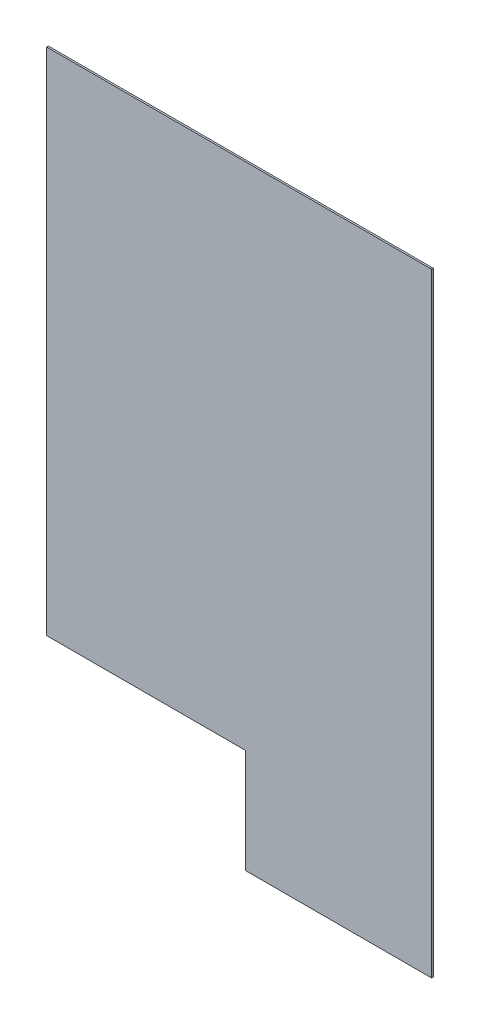
ISO-10303-21;
HEADER;
FILE_DESCRIPTION(('STEP AP214'),'2;1');
FILE_NAME('part.step','',(''),(''),'','','');
FILE_SCHEMA(('AUTOMOTIVE_DESIGN { 1 0 10303 214 1 1 1 1 }'));
ENDSEC;
DATA;
#1=APPLICATION_CONTEXT('core data for automotive mechanical design processes');
#2=APPLICATION_PROTOCOL_DEFINITION('international standard','automotive_design',2000,#1);
#3=PRODUCT_CONTEXT('',#1,'mechanical');
#4=PRODUCT('Part','Part','',(#3));
#5=PRODUCT_RELATED_PRODUCT_CATEGORY('part','',(#4));
#6=PRODUCT_DEFINITION_FORMATION('','',#4);
#7=PRODUCT_DEFINITION_CONTEXT('part definition',#1,'design');
#8=PRODUCT_DEFINITION('design','',#6,#7);
#9=PRODUCT_DEFINITION_SHAPE('','',#8);
#10=(LENGTH_UNIT() NAMED_UNIT(*) SI_UNIT(.MILLI.,.METRE.));
#11=(NAMED_UNIT(*) PLANE_ANGLE_UNIT() SI_UNIT($,.RADIAN.));
#12=(NAMED_UNIT(*) SI_UNIT($,.STERADIAN.) SOLID_ANGLE_UNIT());
#13=UNCERTAINTY_MEASURE_WITH_UNIT(LENGTH_MEASURE(1.E-05),#10,'distance_accuracy_value','');
#14=(GEOMETRIC_REPRESENTATION_CONTEXT(3) GLOBAL_UNCERTAINTY_ASSIGNED_CONTEXT((#13)) GLOBAL_UNIT_ASSIGNED_CONTEXT((#10,
#11,#12)) REPRESENTATION_CONTEXT('',''));
#15=CARTESIAN_POINT('',(0.,0.,0.));
#16=DIRECTION('',(0.,0.,1.));
#17=DIRECTION('',(1.,0.,0.));
#18=AXIS2_PLACEMENT_3D('',#15,#16,#17);
#19=CARTESIAN_POINT('',(47.729000091553,-0.123999997973,0.41148));
#20=DIRECTION('',(0.,0.,-1.));
#21=DIRECTION('',(0.,-1.,0.));
#22=AXIS2_PLACEMENT_3D('',#19,#20,#21);
#23=PLANE('',#22);
#24=DIRECTION('',(-1.,0.,0.));
#25=VECTOR('',#24,1.);
#26=CARTESIAN_POINT('',(92.5,-0.123999997973,0.41148));
#27=LINE('',#26,#25);
#28=CARTESIAN_POINT('',(92.5,-0.123999997973,0.41148));
#29=VERTEX_POINT('',#28);
#30=CARTESIAN_POINT('',(47.729000091553,-0.123999997973,0.41148));
#31=VERTEX_POINT('',#30);
#32=EDGE_CURVE('E27',#29,#31,#27,.T.);
#33=ORIENTED_EDGE('',*,*,#32,.F.);
#34=DIRECTION('',(0.,-1.,0.));
#35=VECTOR('',#34,1.);
#36=CARTESIAN_POINT('',(92.5,147.37600708007,0.41148));
#37=LINE('',#36,#35);
#38=CARTESIAN_POINT('',(92.5,147.37600708007,0.41148));
#39=VERTEX_POINT('',#38);
#40=EDGE_CURVE('E128',#39,#29,#37,.T.);
#41=ORIENTED_EDGE('',*,*,#40,.F.);
#42=DIRECTION('',(1.,0.,0.));
#43=VECTOR('',#42,1.);
#44=CARTESIAN_POINT('',(0.,147.37600708007,0.41148));
#45=LINE('',#44,#43);
#46=CARTESIAN_POINT('',(0.,147.37600708007,0.41148));
#47=VERTEX_POINT('',#46);
#48=EDGE_CURVE('E97',#47,#39,#45,.T.);
#49=ORIENTED_EDGE('',*,*,#48,.F.);
#50=DIRECTION('',(0.,1.,0.));
#51=VECTOR('',#50,1.);
#52=CARTESIAN_POINT('',(0.,24.875999450684,0.41148));
#53=LINE('',#52,#51);
#54=CARTESIAN_POINT('',(0.,24.875999450684,0.41148));
#55=VERTEX_POINT('',#54);
#56=EDGE_CURVE('E20',#55,#47,#53,.T.);
#57=ORIENTED_EDGE('',*,*,#56,.F.);
#58=DIRECTION('',(-1.,0.,0.));
#59=VECTOR('',#58,1.);
#60=CARTESIAN_POINT('',(47.729000091553,24.875999450684,0.41148));
#61=LINE('',#60,#59);
#62=CARTESIAN_POINT('',(47.729000091553,24.875999450684,0.41148));
#63=VERTEX_POINT('',#62);
#64=EDGE_CURVE('E95',#63,#55,#61,.T.);
#65=ORIENTED_EDGE('',*,*,#64,.F.);
#66=DIRECTION('',(0.,1.,0.));
#67=VECTOR('',#66,1.);
#68=CARTESIAN_POINT('',(47.729000091553,-0.123999997973,0.41148));
#69=LINE('',#68,#67);
#70=EDGE_CURVE('E124',#31,#63,#69,.T.);
#71=ORIENTED_EDGE('',*,*,#70,.F.);
#72=EDGE_LOOP('',(#33,#41,#49,#57,#65,#71));
#73=FACE_BOUND('',#72,.T.);
#74=ADVANCED_FACE('F16',(#73),#23,.F.);
#75=CARTESIAN_POINT('',(47.729000091553,-0.123999997973,0.));
#76=DIRECTION('',(0.,0.,-1.));
#77=DIRECTION('',(0.,-1.,0.));
#78=AXIS2_PLACEMENT_3D('',#75,#76,#77);
#79=PLANE('',#78);
#80=DIRECTION('',(0.,1.,0.));
#81=VECTOR('',#80,1.);
#82=CARTESIAN_POINT('',(47.729000091553,-0.123999997973,0.));
#83=LINE('',#82,#81);
#84=CARTESIAN_POINT('',(47.729000091553,-0.123999997973,0.));
#85=VERTEX_POINT('',#84);
#86=CARTESIAN_POINT('',(47.729000091553,24.875999450684,0.));
#87=VERTEX_POINT('',#86);
#88=EDGE_CURVE('E114',#85,#87,#83,.T.);
#89=ORIENTED_EDGE('',*,*,#88,.T.);
#90=DIRECTION('',(-1.,0.,0.));
#91=VECTOR('',#90,1.);
#92=CARTESIAN_POINT('',(47.729000091553,24.875999450684,0.));
#93=LINE('',#92,#91);
#94=CARTESIAN_POINT('',(0.,24.875999450684,0.));
#95=VERTEX_POINT('',#94);
#96=EDGE_CURVE('E85',#87,#95,#93,.T.);
#97=ORIENTED_EDGE('',*,*,#96,.T.);
#98=DIRECTION('',(0.,1.,0.));
#99=VECTOR('',#98,1.);
#100=CARTESIAN_POINT('',(0.,24.875999450684,0.));
#101=LINE('',#100,#99);
#102=CARTESIAN_POINT('',(0.,147.37600708007,0.));
#103=VERTEX_POINT('',#102);
#104=EDGE_CURVE('E106',#95,#103,#101,.T.);
#105=ORIENTED_EDGE('',*,*,#104,.T.);
#106=DIRECTION('',(1.,0.,0.));
#107=VECTOR('',#106,1.);
#108=CARTESIAN_POINT('',(0.,147.37600708007,0.));
#109=LINE('',#108,#107);
#110=CARTESIAN_POINT('',(92.5,147.37600708007,0.));
#111=VERTEX_POINT('',#110);
#112=EDGE_CURVE('E132',#103,#111,#109,.T.);
#113=ORIENTED_EDGE('',*,*,#112,.T.);
#114=DIRECTION('',(0.,-1.,0.));
#115=VECTOR('',#114,1.);
#116=CARTESIAN_POINT('',(92.5,147.37600708007,0.));
#117=LINE('',#116,#115);
#118=CARTESIAN_POINT('',(92.5,-0.123999997973,0.));
#119=VERTEX_POINT('',#118);
#120=EDGE_CURVE('E144',#111,#119,#117,.T.);
#121=ORIENTED_EDGE('',*,*,#120,.T.);
#122=DIRECTION('',(-1.,0.,0.));
#123=VECTOR('',#122,1.);
#124=CARTESIAN_POINT('',(92.5,-0.123999997973,0.));
#125=LINE('',#124,#123);
#126=EDGE_CURVE('E11',#119,#85,#125,.T.);
#127=ORIENTED_EDGE('',*,*,#126,.T.);
#128=EDGE_LOOP('',(#89,#97,#105,#113,#121,#127));
#129=FACE_BOUND('',#128,.T.);
#130=ADVANCED_FACE('F18',(#129),#79,.T.);
#131=CARTESIAN_POINT('',(92.5,-0.123999997973,0.));
#132=DIRECTION('',(0.,-1.,0.));
#133=DIRECTION('',(0.,0.,-1.));
#134=AXIS2_PLACEMENT_3D('',#131,#132,#133);
#135=PLANE('',#134);
#136=DIRECTION('',(0.,0.,1.));
#137=VECTOR('',#136,1.);
#138=CARTESIAN_POINT('',(92.5,-0.123999997973,0.));
#139=LINE('',#138,#137);
#140=EDGE_CURVE('E131',#119,#29,#139,.T.);
#141=ORIENTED_EDGE('',*,*,#140,.T.);
#142=ORIENTED_EDGE('',*,*,#32,.T.);
#143=DIRECTION('',(0.,0.,1.));
#144=VECTOR('',#143,1.);
#145=CARTESIAN_POINT('',(47.729000091553,-0.123999997973,0.));
#146=LINE('',#145,#144);
#147=EDGE_CURVE('E126',#85,#31,#146,.T.);
#148=ORIENTED_EDGE('',*,*,#147,.F.);
#149=ORIENTED_EDGE('',*,*,#126,.F.);
#150=EDGE_LOOP('',(#141,#142,#148,#149));
#151=FACE_BOUND('',#150,.T.);
#152=ADVANCED_FACE('F160',(#151),#135,.T.);
#153=CARTESIAN_POINT('',(92.5,147.37600708007,0.));
#154=DIRECTION('',(1.,0.,0.));
#155=DIRECTION('',(0.,1.,0.));
#156=AXIS2_PLACEMENT_3D('',#153,#154,#155);
#157=PLANE('',#156);
#158=DIRECTION('',(0.,0.,1.));
#159=VECTOR('',#158,1.);
#160=CARTESIAN_POINT('',(92.5,147.37600708007,0.));
#161=LINE('',#160,#159);
#162=EDGE_CURVE('E136',#111,#39,#161,.T.);
#163=ORIENTED_EDGE('',*,*,#162,.T.);
#164=ORIENTED_EDGE('',*,*,#40,.T.);
#165=ORIENTED_EDGE('',*,*,#140,.F.);
#166=ORIENTED_EDGE('',*,*,#120,.F.);
#167=EDGE_LOOP('',(#163,#164,#165,#166));
#168=FACE_BOUND('',#167,.T.);
#169=ADVANCED_FACE('F162',(#168),#157,.T.);
#170=CARTESIAN_POINT('',(0.,147.37600708007,0.));
#171=DIRECTION('',(0.,1.,0.));
#172=DIRECTION('',(1.,0.,0.));
#173=AXIS2_PLACEMENT_3D('',#170,#171,#172);
#174=PLANE('',#173);
#175=DIRECTION('',(0.,0.,1.));
#176=VECTOR('',#175,1.);
#177=CARTESIAN_POINT('',(0.,147.37600708007,0.));
#178=LINE('',#177,#176);
#179=EDGE_CURVE('E102',#103,#47,#178,.T.);
#180=ORIENTED_EDGE('',*,*,#179,.T.);
#181=ORIENTED_EDGE('',*,*,#48,.T.);
#182=ORIENTED_EDGE('',*,*,#162,.F.);
#183=ORIENTED_EDGE('',*,*,#112,.F.);
#184=EDGE_LOOP('',(#180,#181,#182,#183));
#185=FACE_BOUND('',#184,.T.);
#186=ADVANCED_FACE('F167',(#185),#174,.T.);
#187=CARTESIAN_POINT('',(0.,24.875999450684,0.));
#188=DIRECTION('',(-1.,0.,0.));
#189=DIRECTION('',(0.,0.,1.));
#190=AXIS2_PLACEMENT_3D('',#187,#188,#189);
#191=PLANE('',#190);
#192=DIRECTION('',(0.,0.,1.));
#193=VECTOR('',#192,1.);
#194=CARTESIAN_POINT('',(0.,24.875999450684,0.));
#195=LINE('',#194,#193);
#196=EDGE_CURVE('E103',#95,#55,#195,.T.);
#197=ORIENTED_EDGE('',*,*,#196,.T.);
#198=ORIENTED_EDGE('',*,*,#56,.T.);
#199=ORIENTED_EDGE('',*,*,#179,.F.);
#200=ORIENTED_EDGE('',*,*,#104,.F.);
#201=EDGE_LOOP('',(#197,#198,#199,#200));
#202=FACE_BOUND('',#201,.T.);
#203=ADVANCED_FACE('F104',(#202),#191,.T.);
#204=CARTESIAN_POINT('',(47.729000091553,24.875999450684,0.));
#205=DIRECTION('',(0.,-1.,0.));
#206=DIRECTION('',(0.,0.,-1.));
#207=AXIS2_PLACEMENT_3D('',#204,#205,#206);
#208=PLANE('',#207);
#209=DIRECTION('',(0.,0.,1.));
#210=VECTOR('',#209,1.);
#211=CARTESIAN_POINT('',(47.729000091553,24.875999450684,0.));
#212=LINE('',#211,#210);
#213=EDGE_CURVE('E111',#87,#63,#212,.T.);
#214=ORIENTED_EDGE('',*,*,#213,.T.);
#215=ORIENTED_EDGE('',*,*,#64,.T.);
#216=ORIENTED_EDGE('',*,*,#196,.F.);
#217=ORIENTED_EDGE('',*,*,#96,.F.);
#218=EDGE_LOOP('',(#214,#215,#216,#217));
#219=FACE_BOUND('',#218,.T.);
#220=ADVANCED_FACE('F109',(#219),#208,.T.);
#221=CARTESIAN_POINT('',(47.729000091553,-0.123999997973,0.));
#222=DIRECTION('',(-1.,0.,0.));
#223=DIRECTION('',(0.,0.,1.));
#224=AXIS2_PLACEMENT_3D('',#221,#222,#223);
#225=PLANE('',#224);
#226=ORIENTED_EDGE('',*,*,#147,.T.);
#227=ORIENTED_EDGE('',*,*,#70,.T.);
#228=ORIENTED_EDGE('',*,*,#213,.F.);
#229=ORIENTED_EDGE('',*,*,#88,.F.);
#230=EDGE_LOOP('',(#226,#227,#228,#229));
#231=FACE_BOUND('',#230,.T.);
#232=ADVANCED_FACE('F155',(#231),#225,.T.);
#233=CLOSED_SHELL('',(#74,#130,#152,#169,#186,#203,#220,#232));
#234=MANIFOLD_SOLID_BREP('B1',#233);
#235=ADVANCED_BREP_SHAPE_REPRESENTATION('',(#18,#234),#14);
#236=SHAPE_DEFINITION_REPRESENTATION(#9,#235);
ENDSEC;
END-ISO-10303-21;
